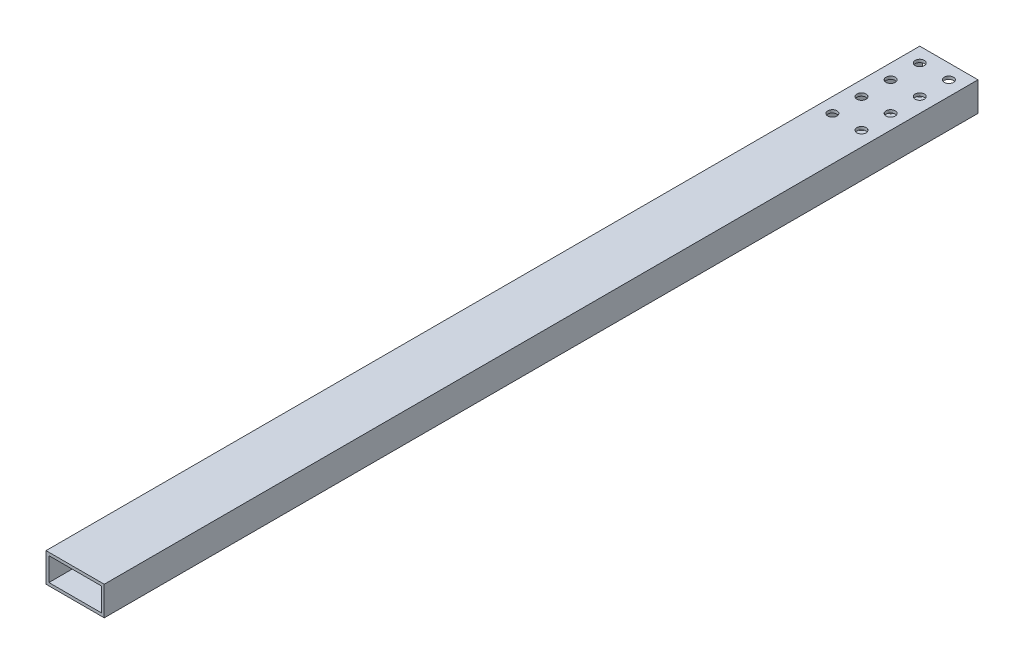
ISO-10303-21;
HEADER;
FILE_DESCRIPTION(('STEP AP214'),'2;1');
FILE_NAME('part.step','',(''),(''),'','','');
FILE_SCHEMA(('AUTOMOTIVE_DESIGN { 1 0 10303 214 1 1 1 1 }'));
ENDSEC;
DATA;
#1=APPLICATION_CONTEXT('core data for automotive mechanical design processes');
#2=APPLICATION_PROTOCOL_DEFINITION('international standard','automotive_design',2000,#1);
#3=PRODUCT_CONTEXT('',#1,'mechanical');
#4=PRODUCT('Part','Part','',(#3));
#5=PRODUCT_RELATED_PRODUCT_CATEGORY('part','',(#4));
#6=PRODUCT_DEFINITION_FORMATION('','',#4);
#7=PRODUCT_DEFINITION_CONTEXT('part definition',#1,'design');
#8=PRODUCT_DEFINITION('design','',#6,#7);
#9=PRODUCT_DEFINITION_SHAPE('','',#8);
#10=(LENGTH_UNIT() NAMED_UNIT(*) SI_UNIT(.MILLI.,.METRE.));
#11=(NAMED_UNIT(*) PLANE_ANGLE_UNIT() SI_UNIT($,.RADIAN.));
#12=(NAMED_UNIT(*) SI_UNIT($,.STERADIAN.) SOLID_ANGLE_UNIT());
#13=UNCERTAINTY_MEASURE_WITH_UNIT(LENGTH_MEASURE(1.E-05),#10,'distance_accuracy_value','');
#14=(GEOMETRIC_REPRESENTATION_CONTEXT(3) GLOBAL_UNCERTAINTY_ASSIGNED_CONTEXT((#13)) GLOBAL_UNIT_ASSIGNED_CONTEXT((#10,
#11,#12)) REPRESENTATION_CONTEXT('',''));
#15=CARTESIAN_POINT('',(0.,0.,0.));
#16=DIRECTION('',(0.,0.,1.));
#17=DIRECTION('',(1.,0.,0.));
#18=AXIS2_PLACEMENT_3D('',#15,#16,#17);
#19=CARTESIAN_POINT('',(0.,0.,300.));
#20=DIRECTION('',(0.,0.,1.));
#21=DIRECTION('',(1.,0.,0.));
#22=AXIS2_PLACEMENT_3D('',#19,#20,#21);
#23=PLANE('',#22);
#24=DIRECTION('',(0.,-1.,0.));
#25=VECTOR('',#24,1.);
#26=CARTESIAN_POINT('',(0.,0.,300.));
#27=LINE('',#26,#25);
#28=CARTESIAN_POINT('',(0.,0.,300.));
#29=VERTEX_POINT('',#28);
#30=CARTESIAN_POINT('',(0.,-10.,300.));
#31=VERTEX_POINT('',#30);
#32=EDGE_CURVE('E170',#29,#31,#27,.T.);
#33=ORIENTED_EDGE('',*,*,#32,.T.);
#34=DIRECTION('',(1.,0.,0.));
#35=VECTOR('',#34,1.);
#36=CARTESIAN_POINT('',(0.,-10.,300.));
#37=LINE('',#36,#35);
#38=CARTESIAN_POINT('',(20.,-10.,300.));
#39=VERTEX_POINT('',#38);
#40=EDGE_CURVE('E173',#31,#39,#37,.T.);
#41=ORIENTED_EDGE('',*,*,#40,.T.);
#42=DIRECTION('',(0.,1.,0.));
#43=VECTOR('',#42,1.);
#44=CARTESIAN_POINT('',(20.,0.,300.));
#45=LINE('',#44,#43);
#46=CARTESIAN_POINT('',(20.,0.,300.));
#47=VERTEX_POINT('',#46);
#48=EDGE_CURVE('E176',#39,#47,#45,.T.);
#49=ORIENTED_EDGE('',*,*,#48,.T.);
#50=DIRECTION('',(-1.,0.,0.));
#51=VECTOR('',#50,1.);
#52=CARTESIAN_POINT('',(0.,0.,300.));
#53=LINE('',#52,#51);
#54=EDGE_CURVE('E178',#47,#29,#53,.T.);
#55=ORIENTED_EDGE('',*,*,#54,.T.);
#56=EDGE_LOOP('',(#33,#41,#49,#55));
#57=FACE_BOUND('',#56,.T.);
#58=DIRECTION('',(1.,0.,0.));
#59=VECTOR('',#58,1.);
#60=CARTESIAN_POINT('',(0.,-9.,300.));
#61=LINE('',#60,#59);
#62=CARTESIAN_POINT('',(1.,-9.,300.));
#63=VERTEX_POINT('',#62);
#64=CARTESIAN_POINT('',(19.,-9.,300.));
#65=VERTEX_POINT('',#64);
#66=EDGE_CURVE('E140',#63,#65,#61,.T.);
#67=ORIENTED_EDGE('',*,*,#66,.F.);
#68=DIRECTION('',(0.,-1.,0.));
#69=VECTOR('',#68,1.);
#70=CARTESIAN_POINT('',(1.,0.,300.));
#71=LINE('',#70,#69);
#72=CARTESIAN_POINT('',(1.,-1.,300.));
#73=VERTEX_POINT('',#72);
#74=EDGE_CURVE('E132',#73,#63,#71,.T.);
#75=ORIENTED_EDGE('',*,*,#74,.F.);
#76=DIRECTION('',(-1.,0.,0.));
#77=VECTOR('',#76,1.);
#78=CARTESIAN_POINT('',(0.,-1.,300.));
#79=LINE('',#78,#77);
#80=CARTESIAN_POINT('',(19.,-1.,300.));
#81=VERTEX_POINT('',#80);
#82=EDGE_CURVE('E154',#81,#73,#79,.T.);
#83=ORIENTED_EDGE('',*,*,#82,.F.);
#84=DIRECTION('',(0.,1.,0.));
#85=VECTOR('',#84,1.);
#86=CARTESIAN_POINT('',(19.,0.,300.));
#87=LINE('',#86,#85);
#88=EDGE_CURVE('E152',#65,#81,#87,.T.);
#89=ORIENTED_EDGE('',*,*,#88,.F.);
#90=EDGE_LOOP('',(#67,#75,#83,#89));
#91=FACE_BOUND('',#90,.T.);
#92=ADVANCED_FACE('F65',(#57,#91),#23,.T.);
#93=CARTESIAN_POINT('',(0.,0.,0.));
#94=DIRECTION('',(0.,0.,1.));
#95=DIRECTION('',(1.,0.,0.));
#96=AXIS2_PLACEMENT_3D('',#93,#94,#95);
#97=PLANE('',#96);
#98=DIRECTION('',(0.,-1.,0.));
#99=VECTOR('',#98,1.);
#100=CARTESIAN_POINT('',(0.,0.,0.));
#101=LINE('',#100,#99);
#102=CARTESIAN_POINT('',(0.,0.,0.));
#103=VERTEX_POINT('',#102);
#104=CARTESIAN_POINT('',(0.,-10.,0.));
#105=VERTEX_POINT('',#104);
#106=EDGE_CURVE('E148',#103,#105,#101,.T.);
#107=ORIENTED_EDGE('',*,*,#106,.F.);
#108=DIRECTION('',(-1.,0.,0.));
#109=VECTOR('',#108,1.);
#110=CARTESIAN_POINT('',(0.,0.,0.));
#111=LINE('',#110,#109);
#112=CARTESIAN_POINT('',(20.,0.,0.));
#113=VERTEX_POINT('',#112);
#114=EDGE_CURVE('E174',#113,#103,#111,.T.);
#115=ORIENTED_EDGE('',*,*,#114,.F.);
#116=DIRECTION('',(0.,1.,0.));
#117=VECTOR('',#116,1.);
#118=CARTESIAN_POINT('',(20.,0.,0.));
#119=LINE('',#118,#117);
#120=CARTESIAN_POINT('',(20.,-10.,0.));
#121=VERTEX_POINT('',#120);
#122=EDGE_CURVE('E185',#121,#113,#119,.T.);
#123=ORIENTED_EDGE('',*,*,#122,.F.);
#124=DIRECTION('',(1.,0.,0.));
#125=VECTOR('',#124,1.);
#126=CARTESIAN_POINT('',(0.,-10.,0.));
#127=LINE('',#126,#125);
#128=EDGE_CURVE('E183',#105,#121,#127,.T.);
#129=ORIENTED_EDGE('',*,*,#128,.F.);
#130=EDGE_LOOP('',(#107,#115,#123,#129));
#131=FACE_BOUND('',#130,.T.);
#132=DIRECTION('',(0.,-1.,0.));
#133=VECTOR('',#132,1.);
#134=CARTESIAN_POINT('',(1.,0.,0.));
#135=LINE('',#134,#133);
#136=CARTESIAN_POINT('',(1.,-1.,0.));
#137=VERTEX_POINT('',#136);
#138=CARTESIAN_POINT('',(1.,-9.,0.));
#139=VERTEX_POINT('',#138);
#140=EDGE_CURVE('E90',#137,#139,#135,.T.);
#141=ORIENTED_EDGE('',*,*,#140,.T.);
#142=DIRECTION('',(1.,0.,0.));
#143=VECTOR('',#142,1.);
#144=CARTESIAN_POINT('',(0.,-9.,0.));
#145=LINE('',#144,#143);
#146=CARTESIAN_POINT('',(19.,-9.,0.));
#147=VERTEX_POINT('',#146);
#148=EDGE_CURVE('E147',#139,#147,#145,.T.);
#149=ORIENTED_EDGE('',*,*,#148,.T.);
#150=DIRECTION('',(0.,1.,0.));
#151=VECTOR('',#150,1.);
#152=CARTESIAN_POINT('',(19.,0.,0.));
#153=LINE('',#152,#151);
#154=CARTESIAN_POINT('',(19.,-1.,0.));
#155=VERTEX_POINT('',#154);
#156=EDGE_CURVE('E162',#147,#155,#153,.T.);
#157=ORIENTED_EDGE('',*,*,#156,.T.);
#158=DIRECTION('',(-1.,0.,0.));
#159=VECTOR('',#158,1.);
#160=CARTESIAN_POINT('',(0.,-1.,0.));
#161=LINE('',#160,#159);
#162=EDGE_CURVE('E141',#155,#137,#161,.T.);
#163=ORIENTED_EDGE('',*,*,#162,.T.);
#164=EDGE_LOOP('',(#141,#149,#157,#163));
#165=FACE_BOUND('',#164,.T.);
#166=ADVANCED_FACE('F261',(#131,#165),#97,.F.);
#167=CARTESIAN_POINT('',(0.,0.,300.));
#168=DIRECTION('',(1.,0.,0.));
#169=DIRECTION('',(0.,1.,0.));
#170=AXIS2_PLACEMENT_3D('',#167,#168,#169);
#171=PLANE('',#170);
#172=ORIENTED_EDGE('',*,*,#106,.T.);
#173=DIRECTION('',(0.,0.,-1.));
#174=VECTOR('',#173,1.);
#175=CARTESIAN_POINT('',(0.,-10.,300.));
#176=LINE('',#175,#174);
#177=EDGE_CURVE('E12',#31,#105,#176,.T.);
#178=ORIENTED_EDGE('',*,*,#177,.F.);
#179=ORIENTED_EDGE('',*,*,#32,.F.);
#180=DIRECTION('',(0.,0.,-1.));
#181=VECTOR('',#180,1.);
#182=CARTESIAN_POINT('',(0.,0.,300.));
#183=LINE('',#182,#181);
#184=EDGE_CURVE('E180',#29,#103,#183,.T.);
#185=ORIENTED_EDGE('',*,*,#184,.T.);
#186=EDGE_LOOP('',(#172,#178,#179,#185));
#187=FACE_BOUND('',#186,.T.);
#188=ADVANCED_FACE('F67',(#187),#171,.F.);
#189=CARTESIAN_POINT('',(0.,-10.,300.));
#190=DIRECTION('',(0.,1.,0.));
#191=DIRECTION('',(0.,0.,1.));
#192=AXIS2_PLACEMENT_3D('',#189,#190,#191);
#193=PLANE('',#192);
#194=CARTESIAN_POINT('',(5.,-10.,5.));
#195=DIRECTION('',(0.,1.,0.));
#196=DIRECTION('',(0.,0.,-1.));
#197=AXIS2_PLACEMENT_3D('',#194,#195,#196);
#198=CIRCLE('',#197,1.575);
#199=CARTESIAN_POINT('',(5.,-10.,3.425));
#200=VERTEX_POINT('',#199);
#201=EDGE_CURVE('E297',#200,#200,#198,.T.);
#202=ORIENTED_EDGE('',*,*,#201,.T.);
#203=EDGE_LOOP('',(#202));
#204=FACE_BOUND('',#203,.T.);
#205=CARTESIAN_POINT('',(5.,-10.,15.));
#206=DIRECTION('',(0.,1.,0.));
#207=DIRECTION('',(0.,0.,1.));
#208=AXIS2_PLACEMENT_3D('',#205,#206,#207);
#209=CIRCLE('',#208,1.575);
#210=CARTESIAN_POINT('',(5.,-10.,16.575));
#211=VERTEX_POINT('',#210);
#212=EDGE_CURVE('E301',#211,#211,#209,.T.);
#213=ORIENTED_EDGE('',*,*,#212,.T.);
#214=EDGE_LOOP('',(#213));
#215=FACE_BOUND('',#214,.T.);
#216=CARTESIAN_POINT('',(15.,-10.,15.));
#217=DIRECTION('',(0.,1.,0.));
#218=DIRECTION('',(0.,0.,-1.));
#219=AXIS2_PLACEMENT_3D('',#216,#217,#218);
#220=CIRCLE('',#219,1.575);
#221=CARTESIAN_POINT('',(15.,-10.,13.425));
#222=VERTEX_POINT('',#221);
#223=EDGE_CURVE('E305',#222,#222,#220,.T.);
#224=ORIENTED_EDGE('',*,*,#223,.T.);
#225=EDGE_LOOP('',(#224));
#226=FACE_BOUND('',#225,.T.);
#227=CARTESIAN_POINT('',(15.,-10.,25.));
#228=DIRECTION('',(0.,1.,0.));
#229=DIRECTION('',(0.,0.,1.));
#230=AXIS2_PLACEMENT_3D('',#227,#228,#229);
#231=CIRCLE('',#230,1.575);
#232=CARTESIAN_POINT('',(15.,-10.,26.575));
#233=VERTEX_POINT('',#232);
#234=EDGE_CURVE('E309',#233,#233,#231,.T.);
#235=ORIENTED_EDGE('',*,*,#234,.T.);
#236=EDGE_LOOP('',(#235));
#237=FACE_BOUND('',#236,.T.);
#238=CARTESIAN_POINT('',(5.,-10.,25.));
#239=DIRECTION('',(0.,1.,0.));
#240=DIRECTION('',(0.,0.,-1.));
#241=AXIS2_PLACEMENT_3D('',#238,#239,#240);
#242=CIRCLE('',#241,1.575);
#243=CARTESIAN_POINT('',(5.,-10.,23.425));
#244=VERTEX_POINT('',#243);
#245=EDGE_CURVE('E313',#244,#244,#242,.T.);
#246=ORIENTED_EDGE('',*,*,#245,.T.);
#247=EDGE_LOOP('',(#246));
#248=FACE_BOUND('',#247,.T.);
#249=CARTESIAN_POINT('',(5.00000000000001,-10.,35.));
#250=DIRECTION('',(0.,1.,0.));
#251=DIRECTION('',(0.,0.,1.));
#252=AXIS2_PLACEMENT_3D('',#249,#250,#251);
#253=CIRCLE('',#252,1.575);
#254=CARTESIAN_POINT('',(5.00000000000001,-10.,36.575));
#255=VERTEX_POINT('',#254);
#256=EDGE_CURVE('E317',#255,#255,#253,.T.);
#257=ORIENTED_EDGE('',*,*,#256,.T.);
#258=EDGE_LOOP('',(#257));
#259=FACE_BOUND('',#258,.T.);
#260=CARTESIAN_POINT('',(15.,-10.,35.));
#261=DIRECTION('',(0.,1.,0.));
#262=DIRECTION('',(0.,0.,-1.));
#263=AXIS2_PLACEMENT_3D('',#260,#261,#262);
#264=CIRCLE('',#263,1.575);
#265=CARTESIAN_POINT('',(15.,-10.,33.425));
#266=VERTEX_POINT('',#265);
#267=EDGE_CURVE('E321',#266,#266,#264,.T.);
#268=ORIENTED_EDGE('',*,*,#267,.T.);
#269=EDGE_LOOP('',(#268));
#270=FACE_BOUND('',#269,.T.);
#271=CARTESIAN_POINT('',(15.,-10.,5.));
#272=DIRECTION('',(0.,1.,0.));
#273=DIRECTION('',(0.,0.,1.));
#274=AXIS2_PLACEMENT_3D('',#271,#272,#273);
#275=CIRCLE('',#274,1.575);
#276=CARTESIAN_POINT('',(15.,-10.,6.575));
#277=VERTEX_POINT('',#276);
#278=EDGE_CURVE('E199',#277,#277,#275,.T.);
#279=ORIENTED_EDGE('',*,*,#278,.T.);
#280=EDGE_LOOP('',(#279));
#281=FACE_BOUND('',#280,.T.);
#282=ORIENTED_EDGE('',*,*,#128,.T.);
#283=DIRECTION('',(0.,0.,-1.));
#284=VECTOR('',#283,1.);
#285=CARTESIAN_POINT('',(20.,-10.,300.));
#286=LINE('',#285,#284);
#287=EDGE_CURVE('E74',#39,#121,#286,.T.);
#288=ORIENTED_EDGE('',*,*,#287,.F.);
#289=ORIENTED_EDGE('',*,*,#40,.F.);
#290=ORIENTED_EDGE('',*,*,#177,.T.);
#291=EDGE_LOOP('',(#282,#288,#289,#290));
#292=FACE_BOUND('',#291,.T.);
#293=ADVANCED_FACE('F286',(#204,#215,#226,#237,#248,#259,#270,#281,#292),#193,.F.);
#294=CARTESIAN_POINT('',(20.,0.,300.));
#295=DIRECTION('',(-1.,0.,0.));
#296=DIRECTION('',(0.,0.,1.));
#297=AXIS2_PLACEMENT_3D('',#294,#295,#296);
#298=PLANE('',#297);
#299=ORIENTED_EDGE('',*,*,#122,.T.);
#300=DIRECTION('',(0.,0.,-1.));
#301=VECTOR('',#300,1.);
#302=CARTESIAN_POINT('',(20.,0.,300.));
#303=LINE('',#302,#301);
#304=EDGE_CURVE('E190',#47,#113,#303,.T.);
#305=ORIENTED_EDGE('',*,*,#304,.F.);
#306=ORIENTED_EDGE('',*,*,#48,.F.);
#307=ORIENTED_EDGE('',*,*,#287,.T.);
#308=EDGE_LOOP('',(#299,#305,#306,#307));
#309=FACE_BOUND('',#308,.T.);
#310=ADVANCED_FACE('F283',(#309),#298,.F.);
#311=CARTESIAN_POINT('',(0.,0.,300.));
#312=DIRECTION('',(0.,-1.,0.));
#313=DIRECTION('',(0.,0.,-1.));
#314=AXIS2_PLACEMENT_3D('',#311,#312,#313);
#315=PLANE('',#314);
#316=CARTESIAN_POINT('',(5.,0.,5.));
#317=DIRECTION('',(0.,1.,0.));
#318=DIRECTION('',(0.,0.,-1.));
#319=AXIS2_PLACEMENT_3D('',#316,#317,#318);
#320=CIRCLE('',#319,1.575);
#321=CARTESIAN_POINT('',(5.,0.,3.425));
#322=VERTEX_POINT('',#321);
#323=EDGE_CURVE('E340',#322,#322,#320,.T.);
#324=ORIENTED_EDGE('',*,*,#323,.F.);
#325=EDGE_LOOP('',(#324));
#326=FACE_BOUND('',#325,.T.);
#327=CARTESIAN_POINT('',(5.,0.,15.));
#328=DIRECTION('',(0.,1.,0.));
#329=DIRECTION('',(0.,0.,1.));
#330=AXIS2_PLACEMENT_3D('',#327,#328,#329);
#331=CIRCLE('',#330,1.575);
#332=CARTESIAN_POINT('',(5.,0.,16.575));
#333=VERTEX_POINT('',#332);
#334=EDGE_CURVE('E443',#333,#333,#331,.T.);
#335=ORIENTED_EDGE('',*,*,#334,.F.);
#336=EDGE_LOOP('',(#335));
#337=FACE_BOUND('',#336,.T.);
#338=CARTESIAN_POINT('',(15.,0.,15.));
#339=DIRECTION('',(0.,1.,0.));
#340=DIRECTION('',(0.,0.,-1.));
#341=AXIS2_PLACEMENT_3D('',#338,#339,#340);
#342=CIRCLE('',#341,1.575);
#343=CARTESIAN_POINT('',(15.,0.,13.425));
#344=VERTEX_POINT('',#343);
#345=EDGE_CURVE('E447',#344,#344,#342,.T.);
#346=ORIENTED_EDGE('',*,*,#345,.F.);
#347=EDGE_LOOP('',(#346));
#348=FACE_BOUND('',#347,.T.);
#349=CARTESIAN_POINT('',(15.,0.,25.));
#350=DIRECTION('',(0.,1.,0.));
#351=DIRECTION('',(0.,0.,1.));
#352=AXIS2_PLACEMENT_3D('',#349,#350,#351);
#353=CIRCLE('',#352,1.575);
#354=CARTESIAN_POINT('',(15.,0.,26.575));
#355=VERTEX_POINT('',#354);
#356=EDGE_CURVE('E423',#355,#355,#353,.T.);
#357=ORIENTED_EDGE('',*,*,#356,.F.);
#358=EDGE_LOOP('',(#357));
#359=FACE_BOUND('',#358,.T.);
#360=CARTESIAN_POINT('',(5.,0.,25.));
#361=DIRECTION('',(0.,1.,0.));
#362=DIRECTION('',(0.,0.,-1.));
#363=AXIS2_PLACEMENT_3D('',#360,#361,#362);
#364=CIRCLE('',#363,1.575);
#365=CARTESIAN_POINT('',(5.,0.,23.425));
#366=VERTEX_POINT('',#365);
#367=EDGE_CURVE('E424',#366,#366,#364,.T.);
#368=ORIENTED_EDGE('',*,*,#367,.F.);
#369=EDGE_LOOP('',(#368));
#370=FACE_BOUND('',#369,.T.);
#371=CARTESIAN_POINT('',(5.00000000000001,0.,35.));
#372=DIRECTION('',(0.,1.,0.));
#373=DIRECTION('',(0.,0.,1.));
#374=AXIS2_PLACEMENT_3D('',#371,#372,#373);
#375=CIRCLE('',#374,1.575);
#376=CARTESIAN_POINT('',(5.00000000000001,0.,36.575));
#377=VERTEX_POINT('',#376);
#378=EDGE_CURVE('E430',#377,#377,#375,.T.);
#379=ORIENTED_EDGE('',*,*,#378,.F.);
#380=EDGE_LOOP('',(#379));
#381=FACE_BOUND('',#380,.T.);
#382=CARTESIAN_POINT('',(15.,0.,35.));
#383=DIRECTION('',(0.,1.,0.));
#384=DIRECTION('',(0.,0.,-1.));
#385=AXIS2_PLACEMENT_3D('',#382,#383,#384);
#386=CIRCLE('',#385,1.575);
#387=CARTESIAN_POINT('',(15.,0.,33.425));
#388=VERTEX_POINT('',#387);
#389=EDGE_CURVE('E436',#388,#388,#386,.T.);
#390=ORIENTED_EDGE('',*,*,#389,.F.);
#391=EDGE_LOOP('',(#390));
#392=FACE_BOUND('',#391,.T.);
#393=CARTESIAN_POINT('',(15.,0.,5.));
#394=DIRECTION('',(0.,1.,0.));
#395=DIRECTION('',(0.,0.,1.));
#396=AXIS2_PLACEMENT_3D('',#393,#394,#395);
#397=CIRCLE('',#396,1.575);
#398=CARTESIAN_POINT('',(15.,0.,6.575));
#399=VERTEX_POINT('',#398);
#400=EDGE_CURVE('E337',#399,#399,#397,.T.);
#401=ORIENTED_EDGE('',*,*,#400,.F.);
#402=EDGE_LOOP('',(#401));
#403=FACE_BOUND('',#402,.T.);
#404=ORIENTED_EDGE('',*,*,#114,.T.);
#405=ORIENTED_EDGE('',*,*,#184,.F.);
#406=ORIENTED_EDGE('',*,*,#54,.F.);
#407=ORIENTED_EDGE('',*,*,#304,.T.);
#408=EDGE_LOOP('',(#404,#405,#406,#407));
#409=FACE_BOUND('',#408,.T.);
#410=ADVANCED_FACE('F280',(#326,#337,#348,#359,#370,#381,#392,#403,#409),#315,.F.);
#411=CARTESIAN_POINT('',(1.,0.,300.));
#412=DIRECTION('',(1.,0.,0.));
#413=DIRECTION('',(0.,1.,0.));
#414=AXIS2_PLACEMENT_3D('',#411,#412,#413);
#415=PLANE('',#414);
#416=ORIENTED_EDGE('',*,*,#140,.F.);
#417=DIRECTION('',(0.,0.,-1.));
#418=VECTOR('',#417,1.);
#419=CARTESIAN_POINT('',(1.,-1.,300.));
#420=LINE('',#419,#418);
#421=EDGE_CURVE('E136',#73,#137,#420,.T.);
#422=ORIENTED_EDGE('',*,*,#421,.F.);
#423=ORIENTED_EDGE('',*,*,#74,.T.);
#424=DIRECTION('',(0.,0.,-1.));
#425=VECTOR('',#424,1.);
#426=CARTESIAN_POINT('',(1.,-9.,300.));
#427=LINE('',#426,#425);
#428=EDGE_CURVE('E135',#63,#139,#427,.T.);
#429=ORIENTED_EDGE('',*,*,#428,.T.);
#430=EDGE_LOOP('',(#416,#422,#423,#429));
#431=FACE_BOUND('',#430,.T.);
#432=ADVANCED_FACE('F134',(#431),#415,.T.);
#433=CARTESIAN_POINT('',(0.,-9.,300.));
#434=DIRECTION('',(0.,1.,0.));
#435=DIRECTION('',(0.,0.,1.));
#436=AXIS2_PLACEMENT_3D('',#433,#434,#435);
#437=PLANE('',#436);
#438=CARTESIAN_POINT('',(5.,-9.,5.));
#439=DIRECTION('',(0.,1.,0.));
#440=DIRECTION('',(0.,0.,1.));
#441=AXIS2_PLACEMENT_3D('',#438,#439,#440);
#442=CIRCLE('',#441,1.575);
#443=CARTESIAN_POINT('',(5.,-9.,6.575));
#444=VERTEX_POINT('',#443);
#445=EDGE_CURVE('E160',#444,#444,#442,.T.);
#446=ORIENTED_EDGE('',*,*,#445,.F.);
#447=EDGE_LOOP('',(#446));
#448=FACE_BOUND('',#447,.T.);
#449=CARTESIAN_POINT('',(5.,-9.,15.));
#450=DIRECTION('',(0.,1.,0.));
#451=DIRECTION('',(0.,0.,1.));
#452=AXIS2_PLACEMENT_3D('',#449,#450,#451);
#453=CIRCLE('',#452,1.575);
#454=CARTESIAN_POINT('',(5.,-9.,16.575));
#455=VERTEX_POINT('',#454);
#456=EDGE_CURVE('E221',#455,#455,#453,.T.);
#457=ORIENTED_EDGE('',*,*,#456,.F.);
#458=EDGE_LOOP('',(#457));
#459=FACE_BOUND('',#458,.T.);
#460=CARTESIAN_POINT('',(15.,-9.,15.));
#461=DIRECTION('',(0.,1.,0.));
#462=DIRECTION('',(0.,0.,1.));
#463=AXIS2_PLACEMENT_3D('',#460,#461,#462);
#464=CIRCLE('',#463,1.575);
#465=CARTESIAN_POINT('',(15.,-9.,16.575));
#466=VERTEX_POINT('',#465);
#467=EDGE_CURVE('E218',#466,#466,#464,.T.);
#468=ORIENTED_EDGE('',*,*,#467,.F.);
#469=EDGE_LOOP('',(#468));
#470=FACE_BOUND('',#469,.T.);
#471=CARTESIAN_POINT('',(15.,-9.,25.));
#472=DIRECTION('',(0.,1.,0.));
#473=DIRECTION('',(0.,0.,1.));
#474=AXIS2_PLACEMENT_3D('',#471,#472,#473);
#475=CIRCLE('',#474,1.575);
#476=CARTESIAN_POINT('',(15.,-9.,26.575));
#477=VERTEX_POINT('',#476);
#478=EDGE_CURVE('E215',#477,#477,#475,.T.);
#479=ORIENTED_EDGE('',*,*,#478,.F.);
#480=EDGE_LOOP('',(#479));
#481=FACE_BOUND('',#480,.T.);
#482=CARTESIAN_POINT('',(5.,-9.,25.));
#483=DIRECTION('',(0.,1.,0.));
#484=DIRECTION('',(0.,0.,1.));
#485=AXIS2_PLACEMENT_3D('',#482,#483,#484);
#486=CIRCLE('',#485,1.575);
#487=CARTESIAN_POINT('',(5.,-9.,26.575));
#488=VERTEX_POINT('',#487);
#489=EDGE_CURVE('E211',#488,#488,#486,.T.);
#490=ORIENTED_EDGE('',*,*,#489,.F.);
#491=EDGE_LOOP('',(#490));
#492=FACE_BOUND('',#491,.T.);
#493=CARTESIAN_POINT('',(5.00000000000001,-9.,35.));
#494=DIRECTION('',(0.,1.,0.));
#495=DIRECTION('',(0.,0.,1.));
#496=AXIS2_PLACEMENT_3D('',#493,#494,#495);
#497=CIRCLE('',#496,1.575);
#498=CARTESIAN_POINT('',(5.00000000000001,-9.,36.575));
#499=VERTEX_POINT('',#498);
#500=EDGE_CURVE('E207',#499,#499,#497,.T.);
#501=ORIENTED_EDGE('',*,*,#500,.F.);
#502=EDGE_LOOP('',(#501));
#503=FACE_BOUND('',#502,.T.);
#504=CARTESIAN_POINT('',(15.,-9.,35.));
#505=DIRECTION('',(0.,1.,0.));
#506=DIRECTION('',(0.,0.,1.));
#507=AXIS2_PLACEMENT_3D('',#504,#505,#506);
#508=CIRCLE('',#507,1.575);
#509=CARTESIAN_POINT('',(15.,-9.,36.575));
#510=VERTEX_POINT('',#509);
#511=EDGE_CURVE('E203',#510,#510,#508,.T.);
#512=ORIENTED_EDGE('',*,*,#511,.F.);
#513=EDGE_LOOP('',(#512));
#514=FACE_BOUND('',#513,.T.);
#515=CARTESIAN_POINT('',(15.,-9.,5.));
#516=DIRECTION('',(0.,1.,0.));
#517=DIRECTION('',(0.,0.,1.));
#518=AXIS2_PLACEMENT_3D('',#515,#516,#517);
#519=CIRCLE('',#518,1.575);
#520=CARTESIAN_POINT('',(15.,-9.,6.575));
#521=VERTEX_POINT('',#520);
#522=EDGE_CURVE('E198',#521,#521,#519,.T.);
#523=ORIENTED_EDGE('',*,*,#522,.F.);
#524=EDGE_LOOP('',(#523));
#525=FACE_BOUND('',#524,.T.);
#526=ORIENTED_EDGE('',*,*,#148,.F.);
#527=ORIENTED_EDGE('',*,*,#428,.F.);
#528=ORIENTED_EDGE('',*,*,#66,.T.);
#529=DIRECTION('',(0.,0.,-1.));
#530=VECTOR('',#529,1.);
#531=CARTESIAN_POINT('',(19.,-9.,300.));
#532=LINE('',#531,#530);
#533=EDGE_CURVE('E149',#65,#147,#532,.T.);
#534=ORIENTED_EDGE('',*,*,#533,.T.);
#535=EDGE_LOOP('',(#526,#527,#528,#534));
#536=FACE_BOUND('',#535,.T.);
#537=ADVANCED_FACE('F144',(#448,#459,#470,#481,#492,#503,#514,#525,#536),#437,.T.);
#538=CARTESIAN_POINT('',(19.,0.,300.));
#539=DIRECTION('',(-1.,0.,0.));
#540=DIRECTION('',(0.,0.,1.));
#541=AXIS2_PLACEMENT_3D('',#538,#539,#540);
#542=PLANE('',#541);
#543=ORIENTED_EDGE('',*,*,#156,.F.);
#544=ORIENTED_EDGE('',*,*,#533,.F.);
#545=ORIENTED_EDGE('',*,*,#88,.T.);
#546=DIRECTION('',(0.,0.,-1.));
#547=VECTOR('',#546,1.);
#548=CARTESIAN_POINT('',(19.,-1.,300.));
#549=LINE('',#548,#547);
#550=EDGE_CURVE('E82',#81,#155,#549,.T.);
#551=ORIENTED_EDGE('',*,*,#550,.T.);
#552=EDGE_LOOP('',(#543,#544,#545,#551));
#553=FACE_BOUND('',#552,.T.);
#554=ADVANCED_FACE('F245',(#553),#542,.T.);
#555=CARTESIAN_POINT('',(0.,-1.,300.));
#556=DIRECTION('',(0.,-1.,0.));
#557=DIRECTION('',(0.,0.,-1.));
#558=AXIS2_PLACEMENT_3D('',#555,#556,#557);
#559=PLANE('',#558);
#560=CARTESIAN_POINT('',(5.,-0.999999999999999,5.));
#561=DIRECTION('',(0.,-1.,0.));
#562=DIRECTION('',(0.,0.,-1.));
#563=AXIS2_PLACEMENT_3D('',#560,#561,#562);
#564=CIRCLE('',#563,1.575);
#565=CARTESIAN_POINT('',(5.,-0.999999999999999,3.425));
#566=VERTEX_POINT('',#565);
#567=EDGE_CURVE('E69',#566,#566,#564,.T.);
#568=ORIENTED_EDGE('',*,*,#567,.F.);
#569=EDGE_LOOP('',(#568));
#570=FACE_BOUND('',#569,.T.);
#571=CARTESIAN_POINT('',(5.,-0.999999999999999,15.));
#572=DIRECTION('',(0.,-1.,0.));
#573=DIRECTION('',(0.,0.,-1.));
#574=AXIS2_PLACEMENT_3D('',#571,#572,#573);
#575=CIRCLE('',#574,1.575);
#576=CARTESIAN_POINT('',(5.,-0.999999999999999,13.425));
#577=VERTEX_POINT('',#576);
#578=EDGE_CURVE('E219',#577,#577,#575,.T.);
#579=ORIENTED_EDGE('',*,*,#578,.F.);
#580=EDGE_LOOP('',(#579));
#581=FACE_BOUND('',#580,.T.);
#582=CARTESIAN_POINT('',(15.,-0.999999999999999,15.));
#583=DIRECTION('',(0.,-1.,0.));
#584=DIRECTION('',(0.,0.,-1.));
#585=AXIS2_PLACEMENT_3D('',#582,#583,#584);
#586=CIRCLE('',#585,1.575);
#587=CARTESIAN_POINT('',(15.,-0.999999999999999,13.425));
#588=VERTEX_POINT('',#587);
#589=EDGE_CURVE('E216',#588,#588,#586,.T.);
#590=ORIENTED_EDGE('',*,*,#589,.F.);
#591=EDGE_LOOP('',(#590));
#592=FACE_BOUND('',#591,.T.);
#593=CARTESIAN_POINT('',(15.,-0.999999999999999,25.));
#594=DIRECTION('',(0.,-1.,0.));
#595=DIRECTION('',(0.,0.,-1.));
#596=AXIS2_PLACEMENT_3D('',#593,#594,#595);
#597=CIRCLE('',#596,1.575);
#598=CARTESIAN_POINT('',(15.,-0.999999999999999,23.425));
#599=VERTEX_POINT('',#598);
#600=EDGE_CURVE('E212',#599,#599,#597,.T.);
#601=ORIENTED_EDGE('',*,*,#600,.F.);
#602=EDGE_LOOP('',(#601));
#603=FACE_BOUND('',#602,.T.);
#604=CARTESIAN_POINT('',(5.,-0.999999999999999,25.));
#605=DIRECTION('',(0.,-1.,0.));
#606=DIRECTION('',(0.,0.,-1.));
#607=AXIS2_PLACEMENT_3D('',#604,#605,#606);
#608=CIRCLE('',#607,1.575);
#609=CARTESIAN_POINT('',(5.,-0.999999999999999,23.425));
#610=VERTEX_POINT('',#609);
#611=EDGE_CURVE('E208',#610,#610,#608,.T.);
#612=ORIENTED_EDGE('',*,*,#611,.F.);
#613=EDGE_LOOP('',(#612));
#614=FACE_BOUND('',#613,.T.);
#615=CARTESIAN_POINT('',(5.00000000000001,-0.999999999999999,35.));
#616=DIRECTION('',(0.,-1.,0.));
#617=DIRECTION('',(0.,0.,-1.));
#618=AXIS2_PLACEMENT_3D('',#615,#616,#617);
#619=CIRCLE('',#618,1.575);
#620=CARTESIAN_POINT('',(5.00000000000001,-0.999999999999999,33.425));
#621=VERTEX_POINT('',#620);
#622=EDGE_CURVE('E204',#621,#621,#619,.T.);
#623=ORIENTED_EDGE('',*,*,#622,.F.);
#624=EDGE_LOOP('',(#623));
#625=FACE_BOUND('',#624,.T.);
#626=CARTESIAN_POINT('',(15.,-0.999999999999999,35.));
#627=DIRECTION('',(0.,-1.,0.));
#628=DIRECTION('',(0.,0.,-1.));
#629=AXIS2_PLACEMENT_3D('',#626,#627,#628);
#630=CIRCLE('',#629,1.575);
#631=CARTESIAN_POINT('',(15.,-0.999999999999999,33.425));
#632=VERTEX_POINT('',#631);
#633=EDGE_CURVE('E200',#632,#632,#630,.T.);
#634=ORIENTED_EDGE('',*,*,#633,.F.);
#635=EDGE_LOOP('',(#634));
#636=FACE_BOUND('',#635,.T.);
#637=CARTESIAN_POINT('',(15.,-0.999999999999999,5.));
#638=DIRECTION('',(0.,-1.,0.));
#639=DIRECTION('',(0.,0.,-1.));
#640=AXIS2_PLACEMENT_3D('',#637,#638,#639);
#641=CIRCLE('',#640,1.575);
#642=CARTESIAN_POINT('',(15.,-0.999999999999999,3.425));
#643=VERTEX_POINT('',#642);
#644=EDGE_CURVE('E195',#643,#643,#641,.T.);
#645=ORIENTED_EDGE('',*,*,#644,.F.);
#646=EDGE_LOOP('',(#645));
#647=FACE_BOUND('',#646,.T.);
#648=ORIENTED_EDGE('',*,*,#162,.F.);
#649=ORIENTED_EDGE('',*,*,#550,.F.);
#650=ORIENTED_EDGE('',*,*,#82,.T.);
#651=ORIENTED_EDGE('',*,*,#421,.T.);
#652=EDGE_LOOP('',(#648,#649,#650,#651));
#653=FACE_BOUND('',#652,.T.);
#654=ADVANCED_FACE('F241',(#570,#581,#592,#603,#614,#625,#636,#647,#653),#559,.T.);
#655=CARTESIAN_POINT('',(15.,-10.,5.));
#656=DIRECTION('',(0.,1.,0.));
#657=DIRECTION('',(0.,0.,1.));
#658=AXIS2_PLACEMENT_3D('',#655,#656,#657);
#659=CYLINDRICAL_SURFACE('',#658,1.575);
#660=ORIENTED_EDGE('',*,*,#644,.T.);
#661=EDGE_LOOP('',(#660));
#662=FACE_BOUND('',#661,.T.);
#663=ORIENTED_EDGE('',*,*,#400,.T.);
#664=EDGE_LOOP('',(#663));
#665=FACE_BOUND('',#664,.T.);
#666=ADVANCED_FACE('F244',(#662,#665),#659,.F.);
#667=CARTESIAN_POINT('',(15.,-10.,35.));
#668=DIRECTION('',(0.,1.,0.));
#669=DIRECTION('',(0.,0.,1.));
#670=AXIS2_PLACEMENT_3D('',#667,#668,#669);
#671=CYLINDRICAL_SURFACE('',#670,1.575);
#672=ORIENTED_EDGE('',*,*,#633,.T.);
#673=EDGE_LOOP('',(#672));
#674=FACE_BOUND('',#673,.T.);
#675=ORIENTED_EDGE('',*,*,#389,.T.);
#676=EDGE_LOOP('',(#675));
#677=FACE_BOUND('',#676,.T.);
#678=ADVANCED_FACE('F374',(#674,#677),#671,.F.);
#679=CARTESIAN_POINT('',(5.00000000000001,-10.,35.));
#680=DIRECTION('',(0.,1.,0.));
#681=DIRECTION('',(0.,0.,1.));
#682=AXIS2_PLACEMENT_3D('',#679,#680,#681);
#683=CYLINDRICAL_SURFACE('',#682,1.575);
#684=ORIENTED_EDGE('',*,*,#622,.T.);
#685=EDGE_LOOP('',(#684));
#686=FACE_BOUND('',#685,.T.);
#687=ORIENTED_EDGE('',*,*,#378,.T.);
#688=EDGE_LOOP('',(#687));
#689=FACE_BOUND('',#688,.T.);
#690=ADVANCED_FACE('F384',(#686,#689),#683,.F.);
#691=CARTESIAN_POINT('',(5.,-10.,25.));
#692=DIRECTION('',(0.,1.,0.));
#693=DIRECTION('',(0.,0.,1.));
#694=AXIS2_PLACEMENT_3D('',#691,#692,#693);
#695=CYLINDRICAL_SURFACE('',#694,1.575);
#696=ORIENTED_EDGE('',*,*,#611,.T.);
#697=EDGE_LOOP('',(#696));
#698=FACE_BOUND('',#697,.T.);
#699=ORIENTED_EDGE('',*,*,#367,.T.);
#700=EDGE_LOOP('',(#699));
#701=FACE_BOUND('',#700,.T.);
#702=ADVANCED_FACE('F392',(#698,#701),#695,.F.);
#703=CARTESIAN_POINT('',(15.,-10.,25.));
#704=DIRECTION('',(0.,1.,0.));
#705=DIRECTION('',(0.,0.,1.));
#706=AXIS2_PLACEMENT_3D('',#703,#704,#705);
#707=CYLINDRICAL_SURFACE('',#706,1.575);
#708=ORIENTED_EDGE('',*,*,#600,.T.);
#709=EDGE_LOOP('',(#708));
#710=FACE_BOUND('',#709,.T.);
#711=ORIENTED_EDGE('',*,*,#356,.T.);
#712=EDGE_LOOP('',(#711));
#713=FACE_BOUND('',#712,.T.);
#714=ADVANCED_FACE('F403',(#710,#713),#707,.F.);
#715=CARTESIAN_POINT('',(15.,-10.,15.));
#716=DIRECTION('',(0.,1.,0.));
#717=DIRECTION('',(0.,0.,1.));
#718=AXIS2_PLACEMENT_3D('',#715,#716,#717);
#719=CYLINDRICAL_SURFACE('',#718,1.575);
#720=ORIENTED_EDGE('',*,*,#589,.T.);
#721=EDGE_LOOP('',(#720));
#722=FACE_BOUND('',#721,.T.);
#723=ORIENTED_EDGE('',*,*,#345,.T.);
#724=EDGE_LOOP('',(#723));
#725=FACE_BOUND('',#724,.T.);
#726=ADVANCED_FACE('F400',(#722,#725),#719,.F.);
#727=CARTESIAN_POINT('',(5.,-10.,15.));
#728=DIRECTION('',(0.,1.,0.));
#729=DIRECTION('',(0.,0.,1.));
#730=AXIS2_PLACEMENT_3D('',#727,#728,#729);
#731=CYLINDRICAL_SURFACE('',#730,1.575);
#732=ORIENTED_EDGE('',*,*,#578,.T.);
#733=EDGE_LOOP('',(#732));
#734=FACE_BOUND('',#733,.T.);
#735=ORIENTED_EDGE('',*,*,#334,.T.);
#736=EDGE_LOOP('',(#735));
#737=FACE_BOUND('',#736,.T.);
#738=ADVANCED_FACE('F375',(#734,#737),#731,.F.);
#739=CARTESIAN_POINT('',(5.,-10.,5.));
#740=DIRECTION('',(0.,1.,0.));
#741=DIRECTION('',(0.,0.,1.));
#742=AXIS2_PLACEMENT_3D('',#739,#740,#741);
#743=CYLINDRICAL_SURFACE('',#742,1.575);
#744=ORIENTED_EDGE('',*,*,#567,.T.);
#745=EDGE_LOOP('',(#744));
#746=FACE_BOUND('',#745,.T.);
#747=ORIENTED_EDGE('',*,*,#323,.T.);
#748=EDGE_LOOP('',(#747));
#749=FACE_BOUND('',#748,.T.);
#750=ADVANCED_FACE('F238',(#746,#749),#743,.F.);
#751=ORIENTED_EDGE('',*,*,#522,.T.);
#752=EDGE_LOOP('',(#751));
#753=FACE_BOUND('',#752,.T.);
#754=ORIENTED_EDGE('',*,*,#278,.F.);
#755=EDGE_LOOP('',(#754));
#756=FACE_BOUND('',#755,.T.);
#757=ADVANCED_FACE('F363',(#753,#756),#659,.F.);
#758=ORIENTED_EDGE('',*,*,#511,.T.);
#759=EDGE_LOOP('',(#758));
#760=FACE_BOUND('',#759,.T.);
#761=ORIENTED_EDGE('',*,*,#267,.F.);
#762=EDGE_LOOP('',(#761));
#763=FACE_BOUND('',#762,.T.);
#764=ADVANCED_FACE('F365',(#760,#763),#671,.F.);
#765=ORIENTED_EDGE('',*,*,#500,.T.);
#766=EDGE_LOOP('',(#765));
#767=FACE_BOUND('',#766,.T.);
#768=ORIENTED_EDGE('',*,*,#256,.F.);
#769=EDGE_LOOP('',(#768));
#770=FACE_BOUND('',#769,.T.);
#771=ADVANCED_FACE('F371',(#767,#770),#683,.F.);
#772=ORIENTED_EDGE('',*,*,#489,.T.);
#773=EDGE_LOOP('',(#772));
#774=FACE_BOUND('',#773,.T.);
#775=ORIENTED_EDGE('',*,*,#245,.F.);
#776=EDGE_LOOP('',(#775));
#777=FACE_BOUND('',#776,.T.);
#778=ADVANCED_FACE('F353',(#774,#777),#695,.F.);
#779=ORIENTED_EDGE('',*,*,#478,.T.);
#780=EDGE_LOOP('',(#779));
#781=FACE_BOUND('',#780,.T.);
#782=ORIENTED_EDGE('',*,*,#234,.F.);
#783=EDGE_LOOP('',(#782));
#784=FACE_BOUND('',#783,.T.);
#785=ADVANCED_FACE('F408',(#781,#784),#707,.F.);
#786=ORIENTED_EDGE('',*,*,#467,.T.);
#787=EDGE_LOOP('',(#786));
#788=FACE_BOUND('',#787,.T.);
#789=ORIENTED_EDGE('',*,*,#223,.F.);
#790=EDGE_LOOP('',(#789));
#791=FACE_BOUND('',#790,.T.);
#792=ADVANCED_FACE('F405',(#788,#791),#719,.F.);
#793=ORIENTED_EDGE('',*,*,#456,.T.);
#794=EDGE_LOOP('',(#793));
#795=FACE_BOUND('',#794,.T.);
#796=ORIENTED_EDGE('',*,*,#212,.F.);
#797=EDGE_LOOP('',(#796));
#798=FACE_BOUND('',#797,.T.);
#799=ADVANCED_FACE('F401',(#795,#798),#731,.F.);
#800=ORIENTED_EDGE('',*,*,#445,.T.);
#801=EDGE_LOOP('',(#800));
#802=FACE_BOUND('',#801,.T.);
#803=ORIENTED_EDGE('',*,*,#201,.F.);
#804=EDGE_LOOP('',(#803));
#805=FACE_BOUND('',#804,.T.);
#806=ADVANCED_FACE('F377',(#802,#805),#743,.F.);
#807=CLOSED_SHELL('',(#92,#166,#188,#293,#310,#410,#432,#537,#554,#654,#666,#678,#690,#702,#714,
#726,#738,#750,#757,#764,#771,#778,#785,#792,#799,#806));
#808=MANIFOLD_SOLID_BREP('B2',#807);
#809=ADVANCED_BREP_SHAPE_REPRESENTATION('',(#18,#808),#14);
#810=SHAPE_DEFINITION_REPRESENTATION(#9,#809);
ENDSEC;
END-ISO-10303-21;
